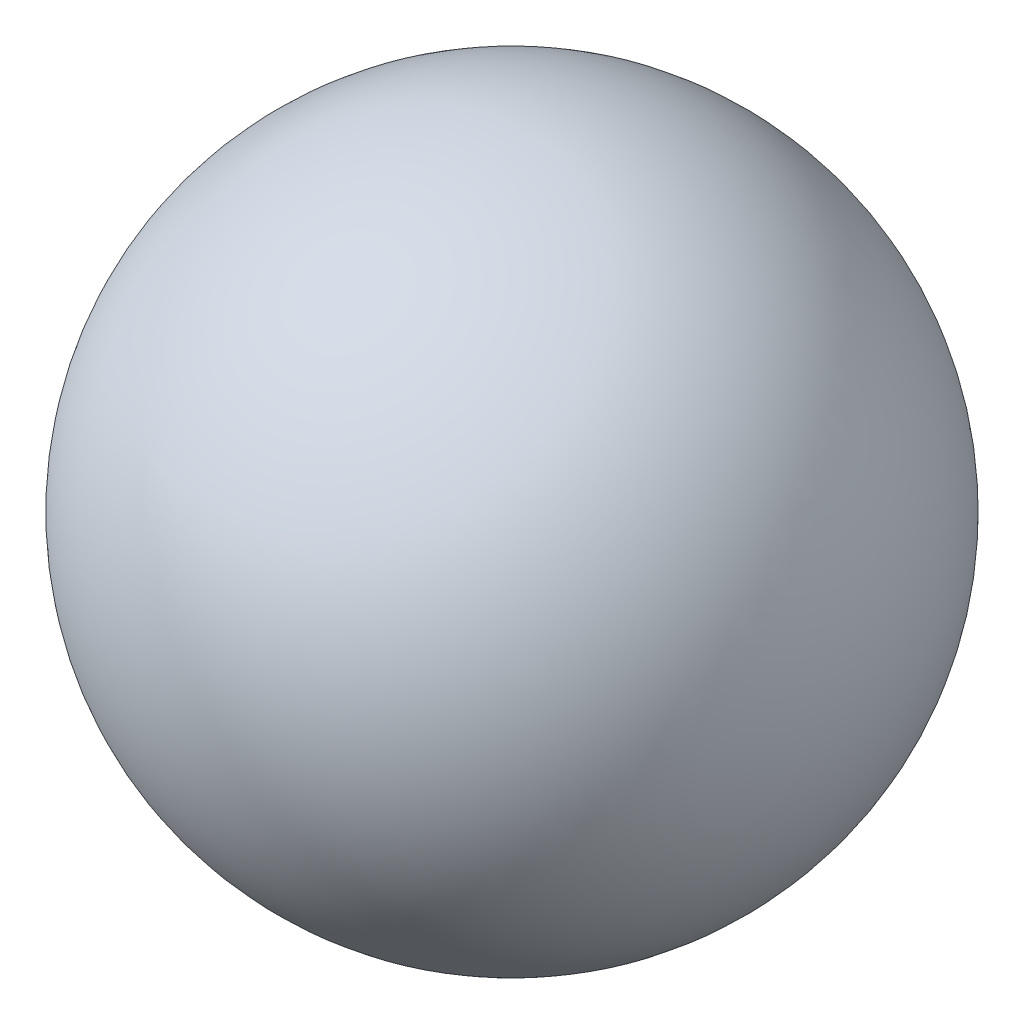
ISO-10303-21;
HEADER;
FILE_DESCRIPTION(('STEP AP214'),'2;1');
FILE_NAME('part.step','',(''),(''),'','','');
FILE_SCHEMA(('AUTOMOTIVE_DESIGN { 1 0 10303 214 1 1 1 1 }'));
ENDSEC;
DATA;
#1=APPLICATION_CONTEXT('core data for automotive mechanical design processes');
#2=APPLICATION_PROTOCOL_DEFINITION('international standard','automotive_design',2000,#1);
#3=PRODUCT_CONTEXT('',#1,'mechanical');
#4=PRODUCT('Part','Part','',(#3));
#5=PRODUCT_RELATED_PRODUCT_CATEGORY('part','',(#4));
#6=PRODUCT_DEFINITION_FORMATION('','',#4);
#7=PRODUCT_DEFINITION_CONTEXT('part definition',#1,'design');
#8=PRODUCT_DEFINITION('design','',#6,#7);
#9=PRODUCT_DEFINITION_SHAPE('','',#8);
#10=(LENGTH_UNIT() NAMED_UNIT(*) SI_UNIT(.MILLI.,.METRE.));
#11=(NAMED_UNIT(*) PLANE_ANGLE_UNIT() SI_UNIT($,.RADIAN.));
#12=(NAMED_UNIT(*) SI_UNIT($,.STERADIAN.) SOLID_ANGLE_UNIT());
#13=UNCERTAINTY_MEASURE_WITH_UNIT(LENGTH_MEASURE(1.E-05),#10,'distance_accuracy_value','');
#14=(GEOMETRIC_REPRESENTATION_CONTEXT(3) GLOBAL_UNCERTAINTY_ASSIGNED_CONTEXT((#13)) GLOBAL_UNIT_ASSIGNED_CONTEXT((#10,
#11,#12)) REPRESENTATION_CONTEXT('',''));
#15=CARTESIAN_POINT('',(0.,0.,0.));
#16=DIRECTION('',(0.,0.,1.));
#17=DIRECTION('',(1.,0.,0.));
#18=AXIS2_PLACEMENT_3D('',#15,#16,#17);
#19=CARTESIAN_POINT('',(0.,0.,0.));
#20=DIRECTION('',(0.,-1.,0.));
#21=DIRECTION('',(1.,0.,0.));
#22=AXIS2_PLACEMENT_3D('',#19,#20,#21);
#23=SPHERICAL_SURFACE('',#22,1.86);
#24=CARTESIAN_POINT('',(0.,-1.86,0.));
#25=VERTEX_POINT('',#24);
#26=VERTEX_LOOP('',#25);
#27=FACE_BOUND('',#26,.T.);
#28=ADVANCED_FACE('F28',(#27),#23,.T.);
#29=CLOSED_SHELL('',(#28));
#30=MANIFOLD_SOLID_BREP('B2',#29);
#31=ADVANCED_BREP_SHAPE_REPRESENTATION('',(#18,#30),#14);
#32=SHAPE_DEFINITION_REPRESENTATION(#9,#31);
ENDSEC;
END-ISO-10303-21;
